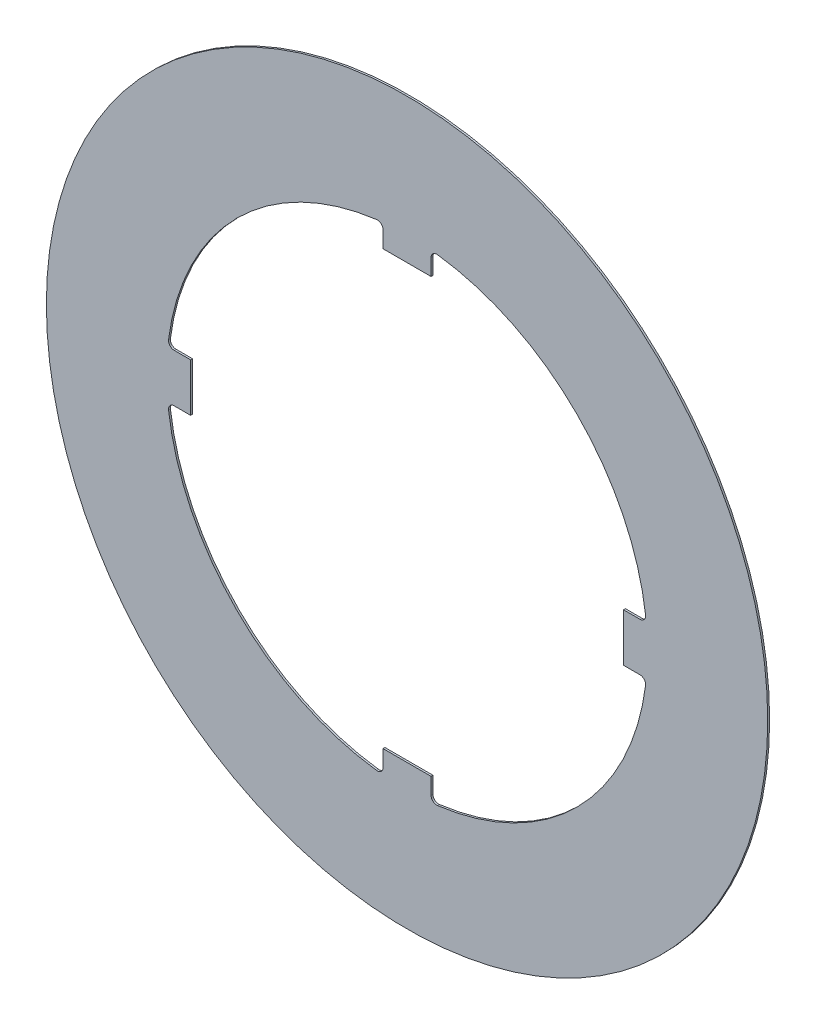
ISO-10303-21;
HEADER;
FILE_DESCRIPTION(('STEP AP214'),'2;1');
FILE_NAME('part.step','',(''),(''),'','','');
FILE_SCHEMA(('AUTOMOTIVE_DESIGN { 1 0 10303 214 1 1 1 1 }'));
ENDSEC;
DATA;
#1=APPLICATION_CONTEXT('core data for automotive mechanical design processes');
#2=APPLICATION_PROTOCOL_DEFINITION('international standard','automotive_design',2000,#1);
#3=PRODUCT_CONTEXT('',#1,'mechanical');
#4=PRODUCT('Part','Part','',(#3));
#5=PRODUCT_RELATED_PRODUCT_CATEGORY('part','',(#4));
#6=PRODUCT_DEFINITION_FORMATION('','',#4);
#7=PRODUCT_DEFINITION_CONTEXT('part definition',#1,'design');
#8=PRODUCT_DEFINITION('design','',#6,#7);
#9=PRODUCT_DEFINITION_SHAPE('','',#8);
#10=(LENGTH_UNIT() NAMED_UNIT(*) SI_UNIT(.MILLI.,.METRE.));
#11=(NAMED_UNIT(*) PLANE_ANGLE_UNIT() SI_UNIT($,.RADIAN.));
#12=(NAMED_UNIT(*) SI_UNIT($,.STERADIAN.) SOLID_ANGLE_UNIT());
#13=UNCERTAINTY_MEASURE_WITH_UNIT(LENGTH_MEASURE(1.E-05),#10,'distance_accuracy_value','');
#14=(GEOMETRIC_REPRESENTATION_CONTEXT(3) GLOBAL_UNCERTAINTY_ASSIGNED_CONTEXT((#13)) GLOBAL_UNIT_ASSIGNED_CONTEXT((#10,
#11,#12)) REPRESENTATION_CONTEXT('',''));
#15=CARTESIAN_POINT('',(0.,0.,0.));
#16=DIRECTION('',(0.,0.,1.));
#17=DIRECTION('',(1.,0.,0.));
#18=AXIS2_PLACEMENT_3D('',#15,#16,#17);
#19=CARTESIAN_POINT('',(0.,0.,5.));
#20=DIRECTION('',(0.,0.,-1.));
#21=DIRECTION('',(-1.,0.,0.));
#22=AXIS2_PLACEMENT_3D('',#19,#20,#21);
#23=CYLINDRICAL_SURFACE('',#22,1270.);
#24=CARTESIAN_POINT('',(0.,0.,-5.));
#25=DIRECTION('',(0.,0.,1.));
#26=DIRECTION('',(1.,0.,0.));
#27=AXIS2_PLACEMENT_3D('',#24,#25,#26);
#28=CIRCLE('',#27,1270.);
#29=CARTESIAN_POINT('',(160.79838709677,-1259.77929761807,-5.));
#30=VERTEX_POINT('',#29);
#31=CARTESIAN_POINT('',(1259.77929761807,-160.798387096774,-5.));
#32=VERTEX_POINT('',#31);
#33=EDGE_CURVE('E242',#30,#32,#28,.T.);
#34=ORIENTED_EDGE('',*,*,#33,.F.);
#35=DIRECTION('',(0.,0.,-1.));
#36=VECTOR('',#35,1.);
#37=CARTESIAN_POINT('',(160.79838709677,-1259.77929761807,5.));
#38=LINE('',#37,#36);
#39=CARTESIAN_POINT('',(160.79838709677,-1259.77929761807,5.));
#40=VERTEX_POINT('',#39);
#41=EDGE_CURVE('E11',#40,#30,#38,.T.);
#42=ORIENTED_EDGE('',*,*,#41,.F.);
#43=CARTESIAN_POINT('',(0.,0.,5.));
#44=DIRECTION('',(0.,0.,1.));
#45=DIRECTION('',(1.,0.,0.));
#46=AXIS2_PLACEMENT_3D('',#43,#44,#45);
#47=CIRCLE('',#46,1270.);
#48=CARTESIAN_POINT('',(1259.77929761807,-160.798387096774,5.));
#49=VERTEX_POINT('',#48);
#50=EDGE_CURVE('E335',#40,#49,#47,.T.);
#51=ORIENTED_EDGE('',*,*,#50,.T.);
#52=DIRECTION('',(0.,0.,-1.));
#53=VECTOR('',#52,1.);
#54=CARTESIAN_POINT('',(1259.77929761807,-160.798387096774,5.));
#55=LINE('',#54,#53);
#56=EDGE_CURVE('E60',#49,#32,#55,.T.);
#57=ORIENTED_EDGE('',*,*,#56,.T.);
#58=EDGE_LOOP('',(#34,#42,#51,#57));
#59=FACE_BOUND('',#58,.T.);
#60=ADVANCED_FACE('F43',(#59),#23,.F.);
#61=CARTESIAN_POINT('',(156.999999999996,-1230.0207315326,5.));
#62=DIRECTION('',(0.,0.,-1.));
#63=DIRECTION('',(-1.,0.,0.));
#64=AXIS2_PLACEMENT_3D('',#61,#62,#63);
#65=CYLINDRICAL_SURFACE('',#64,30.0000000000002);
#66=CARTESIAN_POINT('',(156.999999999996,-1230.0207315326,-5.));
#67=DIRECTION('',(0.,0.,1.));
#68=DIRECTION('',(1.,0.,0.));
#69=AXIS2_PLACEMENT_3D('',#66,#67,#68);
#70=CIRCLE('',#69,30.0000000000002);
#71=CARTESIAN_POINT('',(126.999999999996,-1230.0207315326,-5.));
#72=VERTEX_POINT('',#71);
#73=EDGE_CURVE('E245',#30,#72,#70,.F.);
#74=ORIENTED_EDGE('',*,*,#73,.T.);
#75=DIRECTION('',(0.,0.,-1.));
#76=VECTOR('',#75,1.);
#77=CARTESIAN_POINT('',(126.999999999996,-1230.0207315326,5.));
#78=LINE('',#77,#76);
#79=CARTESIAN_POINT('',(126.999999999996,-1230.0207315326,5.));
#80=VERTEX_POINT('',#79);
#81=EDGE_CURVE('E52',#80,#72,#78,.T.);
#82=ORIENTED_EDGE('',*,*,#81,.F.);
#83=CARTESIAN_POINT('',(156.999999999996,-1230.0207315326,5.));
#84=DIRECTION('',(0.,0.,1.));
#85=DIRECTION('',(1.,0.,0.));
#86=AXIS2_PLACEMENT_3D('',#83,#84,#85);
#87=CIRCLE('',#86,30.0000000000002);
#88=EDGE_CURVE('E865',#40,#80,#87,.F.);
#89=ORIENTED_EDGE('',*,*,#88,.F.);
#90=ORIENTED_EDGE('',*,*,#41,.T.);
#91=EDGE_LOOP('',(#74,#82,#89,#90));
#92=FACE_BOUND('',#91,.T.);
#93=ADVANCED_FACE('F408',(#92),#65,.F.);
#94=CARTESIAN_POINT('',(127.,-4.05071072272497E-13,5.));
#95=DIRECTION('',(1.,0.,0.));
#96=DIRECTION('',(0.,1.,0.));
#97=AXIS2_PLACEMENT_3D('',#94,#95,#96);
#98=PLANE('',#97);
#99=DIRECTION('',(0.,-1.,0.));
#100=VECTOR('',#99,1.);
#101=CARTESIAN_POINT('',(127.,-4.05071072272497E-13,-5.));
#102=LINE('',#101,#100);
#103=CARTESIAN_POINT('',(126.999999999996,-1143.,-5.));
#104=VERTEX_POINT('',#103);
#105=EDGE_CURVE('E249',#104,#72,#102,.T.);
#106=ORIENTED_EDGE('',*,*,#105,.F.);
#107=DIRECTION('',(0.,0.,-1.));
#108=VECTOR('',#107,1.);
#109=CARTESIAN_POINT('',(126.999999999996,-1143.,5.));
#110=LINE('',#109,#108);
#111=CARTESIAN_POINT('',(126.999999999996,-1143.,5.));
#112=VERTEX_POINT('',#111);
#113=EDGE_CURVE('E396',#112,#104,#110,.T.);
#114=ORIENTED_EDGE('',*,*,#113,.F.);
#115=DIRECTION('',(0.,-1.,0.));
#116=VECTOR('',#115,1.);
#117=CARTESIAN_POINT('',(127.,-4.05071072272497E-13,5.));
#118=LINE('',#117,#116);
#119=EDGE_CURVE('E405',#112,#80,#118,.T.);
#120=ORIENTED_EDGE('',*,*,#119,.T.);
#121=ORIENTED_EDGE('',*,*,#81,.T.);
#122=EDGE_LOOP('',(#106,#114,#120,#121));
#123=FACE_BOUND('',#122,.T.);
#124=ADVANCED_FACE('F403',(#123),#98,.T.);
#125=CARTESIAN_POINT('',(-3.99680288865056E-12,-1143.,5.));
#126=DIRECTION('',(0.,-1.,0.));
#127=DIRECTION('',(1.,0.,0.));
#128=AXIS2_PLACEMENT_3D('',#125,#126,#127);
#129=PLANE('',#128);
#130=DIRECTION('',(-1.,0.,0.));
#131=VECTOR('',#130,1.);
#132=CARTESIAN_POINT('',(-3.99680288865056E-12,-1143.,-5.));
#133=LINE('',#132,#131);
#134=CARTESIAN_POINT('',(-127.000000000004,-1143.,-5.));
#135=VERTEX_POINT('',#134);
#136=EDGE_CURVE('E253',#104,#135,#133,.T.);
#137=ORIENTED_EDGE('',*,*,#136,.T.);
#138=DIRECTION('',(0.,0.,-1.));
#139=VECTOR('',#138,1.);
#140=CARTESIAN_POINT('',(-127.000000000004,-1143.,5.));
#141=LINE('',#140,#139);
#142=CARTESIAN_POINT('',(-127.000000000004,-1143.,5.));
#143=VERTEX_POINT('',#142);
#144=EDGE_CURVE('E392',#143,#135,#141,.T.);
#145=ORIENTED_EDGE('',*,*,#144,.F.);
#146=DIRECTION('',(-1.,0.,0.));
#147=VECTOR('',#146,1.);
#148=CARTESIAN_POINT('',(-3.99680288865056E-12,-1143.,5.));
#149=LINE('',#148,#147);
#150=EDGE_CURVE('E427',#112,#143,#149,.T.);
#151=ORIENTED_EDGE('',*,*,#150,.F.);
#152=ORIENTED_EDGE('',*,*,#113,.T.);
#153=EDGE_LOOP('',(#137,#145,#151,#152));
#154=FACE_BOUND('',#153,.T.);
#155=ADVANCED_FACE('F416',(#154),#129,.F.);
#156=CARTESIAN_POINT('',(-126.999999999999,5.26592393954245E-13,5.));
#157=DIRECTION('',(1.,0.,0.));
#158=DIRECTION('',(0.,1.,0.));
#159=AXIS2_PLACEMENT_3D('',#156,#157,#158);
#160=PLANE('',#159);
#161=DIRECTION('',(0.,-1.,0.));
#162=VECTOR('',#161,1.);
#163=CARTESIAN_POINT('',(-126.999999999999,5.26592393954245E-13,-5.));
#164=LINE('',#163,#162);
#165=CARTESIAN_POINT('',(-127.000000000004,-1230.0207315326,-5.));
#166=VERTEX_POINT('',#165);
#167=EDGE_CURVE('E256',#135,#166,#164,.T.);
#168=ORIENTED_EDGE('',*,*,#167,.T.);
#169=DIRECTION('',(0.,0.,-1.));
#170=VECTOR('',#169,1.);
#171=CARTESIAN_POINT('',(-127.000000000004,-1230.0207315326,5.));
#172=LINE('',#171,#170);
#173=CARTESIAN_POINT('',(-127.000000000004,-1230.0207315326,5.));
#174=VERTEX_POINT('',#173);
#175=EDGE_CURVE('E389',#174,#166,#172,.T.);
#176=ORIENTED_EDGE('',*,*,#175,.F.);
#177=DIRECTION('',(0.,-1.,0.));
#178=VECTOR('',#177,1.);
#179=CARTESIAN_POINT('',(-126.999999999999,5.26592393954245E-13,5.));
#180=LINE('',#179,#178);
#181=EDGE_CURVE('E422',#143,#174,#180,.T.);
#182=ORIENTED_EDGE('',*,*,#181,.F.);
#183=ORIENTED_EDGE('',*,*,#144,.T.);
#184=EDGE_LOOP('',(#168,#176,#182,#183));
#185=FACE_BOUND('',#184,.T.);
#186=ADVANCED_FACE('F420',(#185),#160,.F.);
#187=CARTESIAN_POINT('',(-157.000000000004,-1230.0207315326,5.));
#188=DIRECTION('',(0.,0.,-1.));
#189=DIRECTION('',(-1.,0.,0.));
#190=AXIS2_PLACEMENT_3D('',#187,#188,#189);
#191=CYLINDRICAL_SURFACE('',#190,30.);
#192=CARTESIAN_POINT('',(-157.000000000004,-1230.0207315326,-5.));
#193=DIRECTION('',(0.,0.,1.));
#194=DIRECTION('',(1.,0.,0.));
#195=AXIS2_PLACEMENT_3D('',#192,#193,#194);
#196=CIRCLE('',#195,30.);
#197=CARTESIAN_POINT('',(-160.798387096779,-1259.77929761807,-5.));
#198=VERTEX_POINT('',#197);
#199=EDGE_CURVE('E260',#198,#166,#196,.T.);
#200=ORIENTED_EDGE('',*,*,#199,.F.);
#201=DIRECTION('',(0.,0.,-1.));
#202=VECTOR('',#201,1.);
#203=CARTESIAN_POINT('',(-160.798387096779,-1259.77929761807,5.));
#204=LINE('',#203,#202);
#205=CARTESIAN_POINT('',(-160.798387096779,-1259.77929761807,5.));
#206=VERTEX_POINT('',#205);
#207=EDGE_CURVE('E386',#206,#198,#204,.T.);
#208=ORIENTED_EDGE('',*,*,#207,.F.);
#209=CARTESIAN_POINT('',(-157.000000000004,-1230.0207315326,5.));
#210=DIRECTION('',(0.,0.,1.));
#211=DIRECTION('',(1.,0.,0.));
#212=AXIS2_PLACEMENT_3D('',#209,#210,#211);
#213=CIRCLE('',#212,30.);
#214=EDGE_CURVE('E426',#206,#174,#213,.T.);
#215=ORIENTED_EDGE('',*,*,#214,.T.);
#216=ORIENTED_EDGE('',*,*,#175,.T.);
#217=EDGE_LOOP('',(#200,#208,#215,#216));
#218=FACE_BOUND('',#217,.T.);
#219=ADVANCED_FACE('F513',(#218),#191,.F.);
#220=CARTESIAN_POINT('',(0.,0.,5.));
#221=DIRECTION('',(0.,0.,-1.));
#222=DIRECTION('',(-1.,0.,0.));
#223=AXIS2_PLACEMENT_3D('',#220,#221,#222);
#224=CYLINDRICAL_SURFACE('',#223,1270.);
#225=CARTESIAN_POINT('',(0.,0.,-5.));
#226=DIRECTION('',(0.,0.,1.));
#227=DIRECTION('',(1.,0.,0.));
#228=AXIS2_PLACEMENT_3D('',#225,#226,#227);
#229=CIRCLE('',#228,1270.);
#230=CARTESIAN_POINT('',(-1259.77929761807,-160.798387096765,-5.));
#231=VERTEX_POINT('',#230);
#232=EDGE_CURVE('E264',#231,#198,#229,.T.);
#233=ORIENTED_EDGE('',*,*,#232,.F.);
#234=DIRECTION('',(0.,0.,-1.));
#235=VECTOR('',#234,1.);
#236=CARTESIAN_POINT('',(-1259.77929761807,-160.798387096765,5.));
#237=LINE('',#236,#235);
#238=CARTESIAN_POINT('',(-1259.77929761807,-160.798387096765,5.));
#239=VERTEX_POINT('',#238);
#240=EDGE_CURVE('E383',#239,#231,#237,.T.);
#241=ORIENTED_EDGE('',*,*,#240,.F.);
#242=CARTESIAN_POINT('',(0.,0.,5.));
#243=DIRECTION('',(0.,0.,1.));
#244=DIRECTION('',(1.,0.,0.));
#245=AXIS2_PLACEMENT_3D('',#242,#243,#244);
#246=CIRCLE('',#245,1270.);
#247=EDGE_CURVE('E431',#239,#206,#246,.T.);
#248=ORIENTED_EDGE('',*,*,#247,.T.);
#249=ORIENTED_EDGE('',*,*,#207,.T.);
#250=EDGE_LOOP('',(#233,#241,#248,#249));
#251=FACE_BOUND('',#250,.T.);
#252=ADVANCED_FACE('F516',(#251),#224,.F.);
#253=CARTESIAN_POINT('',(-1230.0207315326,-156.999999999991,5.));
#254=DIRECTION('',(0.,0.,-1.));
#255=DIRECTION('',(-1.,0.,0.));
#256=AXIS2_PLACEMENT_3D('',#253,#254,#255);
#257=CYLINDRICAL_SURFACE('',#256,30.0000000000001);
#258=CARTESIAN_POINT('',(-1230.0207315326,-156.999999999991,-5.));
#259=DIRECTION('',(0.,0.,1.));
#260=DIRECTION('',(1.,0.,0.));
#261=AXIS2_PLACEMENT_3D('',#258,#259,#260);
#262=CIRCLE('',#261,30.0000000000001);
#263=CARTESIAN_POINT('',(-1230.0207315326,-126.999999999991,-5.));
#264=VERTEX_POINT('',#263);
#265=EDGE_CURVE('E268',#231,#264,#262,.F.);
#266=ORIENTED_EDGE('',*,*,#265,.T.);
#267=DIRECTION('',(0.,0.,-1.));
#268=VECTOR('',#267,1.);
#269=CARTESIAN_POINT('',(-1230.0207315326,-126.999999999991,5.));
#270=LINE('',#269,#268);
#271=CARTESIAN_POINT('',(-1230.0207315326,-126.999999999991,5.));
#272=VERTEX_POINT('',#271);
#273=EDGE_CURVE('E380',#272,#264,#270,.T.);
#274=ORIENTED_EDGE('',*,*,#273,.F.);
#275=CARTESIAN_POINT('',(-1230.0207315326,-156.999999999991,5.));
#276=DIRECTION('',(0.,0.,1.));
#277=DIRECTION('',(1.,0.,0.));
#278=AXIS2_PLACEMENT_3D('',#275,#276,#277);
#279=CIRCLE('',#278,30.0000000000001);
#280=EDGE_CURVE('E439',#239,#272,#279,.F.);
#281=ORIENTED_EDGE('',*,*,#280,.F.);
#282=ORIENTED_EDGE('',*,*,#240,.T.);
#283=EDGE_LOOP('',(#266,#274,#281,#282));
#284=FACE_BOUND('',#283,.T.);
#285=ADVANCED_FACE('F520',(#284),#257,.F.);
#286=CARTESIAN_POINT('',(-8.10142144544992E-13,-126.999999999999,5.));
#287=DIRECTION('',(0.,-1.,0.));
#288=DIRECTION('',(1.,0.,0.));
#289=AXIS2_PLACEMENT_3D('',#286,#287,#288);
#290=PLANE('',#289);
#291=DIRECTION('',(-1.,0.,0.));
#292=VECTOR('',#291,1.);
#293=CARTESIAN_POINT('',(-8.10142144544992E-13,-126.999999999999,-5.));
#294=LINE('',#293,#292);
#295=CARTESIAN_POINT('',(-1143.,-126.999999999992,-5.));
#296=VERTEX_POINT('',#295);
#297=EDGE_CURVE('E272',#296,#264,#294,.T.);
#298=ORIENTED_EDGE('',*,*,#297,.F.);
#299=DIRECTION('',(0.,0.,-1.));
#300=VECTOR('',#299,1.);
#301=CARTESIAN_POINT('',(-1143.,-126.999999999992,5.));
#302=LINE('',#301,#300);
#303=CARTESIAN_POINT('',(-1143.,-126.999999999992,5.));
#304=VERTEX_POINT('',#303);
#305=EDGE_CURVE('E377',#304,#296,#302,.T.);
#306=ORIENTED_EDGE('',*,*,#305,.F.);
#307=DIRECTION('',(-1.,0.,0.));
#308=VECTOR('',#307,1.);
#309=CARTESIAN_POINT('',(-8.10142144544992E-13,-126.999999999999,5.));
#310=LINE('',#309,#308);
#311=EDGE_CURVE('E442',#304,#272,#310,.T.);
#312=ORIENTED_EDGE('',*,*,#311,.T.);
#313=ORIENTED_EDGE('',*,*,#273,.T.);
#314=EDGE_LOOP('',(#298,#306,#312,#313));
#315=FACE_BOUND('',#314,.T.);
#316=ADVANCED_FACE('F524',(#315),#290,.T.);
#317=CARTESIAN_POINT('',(-1143.,7.99360577730113E-12,5.));
#318=DIRECTION('',(-1.,0.,0.));
#319=DIRECTION('',(0.,-1.,0.));
#320=AXIS2_PLACEMENT_3D('',#317,#318,#319);
#321=PLANE('',#320);
#322=DIRECTION('',(0.,1.,0.));
#323=VECTOR('',#322,1.);
#324=CARTESIAN_POINT('',(-1143.,7.99360577730113E-12,-5.));
#325=LINE('',#324,#323);
#326=CARTESIAN_POINT('',(-1143.,127.000000000008,-5.));
#327=VERTEX_POINT('',#326);
#328=EDGE_CURVE('E276',#296,#327,#325,.T.);
#329=ORIENTED_EDGE('',*,*,#328,.T.);
#330=DIRECTION('',(0.,0.,-1.));
#331=VECTOR('',#330,1.);
#332=CARTESIAN_POINT('',(-1143.,127.000000000008,5.));
#333=LINE('',#332,#331);
#334=CARTESIAN_POINT('',(-1143.,127.000000000008,5.));
#335=VERTEX_POINT('',#334);
#336=EDGE_CURVE('E373',#335,#327,#333,.T.);
#337=ORIENTED_EDGE('',*,*,#336,.F.);
#338=DIRECTION('',(0.,1.,0.));
#339=VECTOR('',#338,1.);
#340=CARTESIAN_POINT('',(-1143.,7.99360577730113E-12,5.));
#341=LINE('',#340,#339);
#342=EDGE_CURVE('E446',#304,#335,#341,.T.);
#343=ORIENTED_EDGE('',*,*,#342,.F.);
#344=ORIENTED_EDGE('',*,*,#305,.T.);
#345=EDGE_LOOP('',(#329,#337,#343,#344));
#346=FACE_BOUND('',#345,.T.);
#347=ADVANCED_FACE('F528',(#346),#321,.F.);
#348=CARTESIAN_POINT('',(9.31663466226743E-13,127.,5.));
#349=DIRECTION('',(0.,-1.,0.));
#350=DIRECTION('',(1.,0.,0.));
#351=AXIS2_PLACEMENT_3D('',#348,#349,#350);
#352=PLANE('',#351);
#353=DIRECTION('',(-1.,0.,0.));
#354=VECTOR('',#353,1.);
#355=CARTESIAN_POINT('',(9.31663466226743E-13,127.,-5.));
#356=LINE('',#355,#354);
#357=CARTESIAN_POINT('',(-1230.0207315326,127.000000000009,-5.));
#358=VERTEX_POINT('',#357);
#359=EDGE_CURVE('E279',#327,#358,#356,.T.);
#360=ORIENTED_EDGE('',*,*,#359,.T.);
#361=DIRECTION('',(0.,0.,-1.));
#362=VECTOR('',#361,1.);
#363=CARTESIAN_POINT('',(-1230.0207315326,127.000000000009,5.));
#364=LINE('',#363,#362);
#365=CARTESIAN_POINT('',(-1230.0207315326,127.000000000009,5.));
#366=VERTEX_POINT('',#365);
#367=EDGE_CURVE('E370',#366,#358,#364,.T.);
#368=ORIENTED_EDGE('',*,*,#367,.F.);
#369=DIRECTION('',(-1.,0.,0.));
#370=VECTOR('',#369,1.);
#371=CARTESIAN_POINT('',(9.31663466226743E-13,127.,5.));
#372=LINE('',#371,#370);
#373=EDGE_CURVE('E449',#335,#366,#372,.T.);
#374=ORIENTED_EDGE('',*,*,#373,.F.);
#375=ORIENTED_EDGE('',*,*,#336,.T.);
#376=EDGE_LOOP('',(#360,#368,#374,#375));
#377=FACE_BOUND('',#376,.T.);
#378=ADVANCED_FACE('F532',(#377),#352,.F.);
#379=CARTESIAN_POINT('',(-1230.0207315326,157.000000000009,5.));
#380=DIRECTION('',(0.,0.,-1.));
#381=DIRECTION('',(-1.,0.,0.));
#382=AXIS2_PLACEMENT_3D('',#379,#380,#381);
#383=CYLINDRICAL_SURFACE('',#382,30.0000000000001);
#384=CARTESIAN_POINT('',(-1230.0207315326,157.000000000009,-5.));
#385=DIRECTION('',(0.,0.,1.));
#386=DIRECTION('',(1.,0.,0.));
#387=AXIS2_PLACEMENT_3D('',#384,#385,#386);
#388=CIRCLE('',#387,30.0000000000001);
#389=CARTESIAN_POINT('',(-1259.77929761807,160.798387096783,-5.));
#390=VERTEX_POINT('',#389);
#391=EDGE_CURVE('E283',#390,#358,#388,.T.);
#392=ORIENTED_EDGE('',*,*,#391,.F.);
#393=DIRECTION('',(0.,0.,-1.));
#394=VECTOR('',#393,1.);
#395=CARTESIAN_POINT('',(-1259.77929761807,160.798387096783,5.));
#396=LINE('',#395,#394);
#397=CARTESIAN_POINT('',(-1259.77929761807,160.798387096783,5.));
#398=VERTEX_POINT('',#397);
#399=EDGE_CURVE('E367',#398,#390,#396,.T.);
#400=ORIENTED_EDGE('',*,*,#399,.F.);
#401=CARTESIAN_POINT('',(-1230.0207315326,157.000000000009,5.));
#402=DIRECTION('',(0.,0.,1.));
#403=DIRECTION('',(1.,0.,0.));
#404=AXIS2_PLACEMENT_3D('',#401,#402,#403);
#405=CIRCLE('',#404,30.0000000000001);
#406=EDGE_CURVE('E452',#398,#366,#405,.T.);
#407=ORIENTED_EDGE('',*,*,#406,.T.);
#408=ORIENTED_EDGE('',*,*,#367,.T.);
#409=EDGE_LOOP('',(#392,#400,#407,#408));
#410=FACE_BOUND('',#409,.T.);
#411=ADVANCED_FACE('F536',(#410),#383,.F.);
#412=CARTESIAN_POINT('',(0.,0.,5.));
#413=DIRECTION('',(0.,0.,-1.));
#414=DIRECTION('',(-1.,0.,0.));
#415=AXIS2_PLACEMENT_3D('',#412,#413,#414);
#416=CYLINDRICAL_SURFACE('',#415,1270.);
#417=CARTESIAN_POINT('',(0.,0.,-5.));
#418=DIRECTION('',(0.,0.,1.));
#419=DIRECTION('',(1.,0.,0.));
#420=AXIS2_PLACEMENT_3D('',#417,#418,#419);
#421=CIRCLE('',#420,1270.);
#422=CARTESIAN_POINT('',(-160.798387096761,1259.77929761807,-5.));
#423=VERTEX_POINT('',#422);
#424=EDGE_CURVE('E287',#423,#390,#421,.T.);
#425=ORIENTED_EDGE('',*,*,#424,.F.);
#426=DIRECTION('',(0.,0.,-1.));
#427=VECTOR('',#426,1.);
#428=CARTESIAN_POINT('',(-160.798387096761,1259.77929761807,5.));
#429=LINE('',#428,#427);
#430=CARTESIAN_POINT('',(-160.798387096761,1259.77929761807,5.));
#431=VERTEX_POINT('',#430);
#432=EDGE_CURVE('E364',#431,#423,#429,.T.);
#433=ORIENTED_EDGE('',*,*,#432,.F.);
#434=CARTESIAN_POINT('',(0.,0.,5.));
#435=DIRECTION('',(0.,0.,1.));
#436=DIRECTION('',(1.,0.,0.));
#437=AXIS2_PLACEMENT_3D('',#434,#435,#436);
#438=CIRCLE('',#437,1270.);
#439=EDGE_CURVE('E456',#431,#398,#438,.T.);
#440=ORIENTED_EDGE('',*,*,#439,.T.);
#441=ORIENTED_EDGE('',*,*,#399,.T.);
#442=EDGE_LOOP('',(#425,#433,#440,#441));
#443=FACE_BOUND('',#442,.T.);
#444=ADVANCED_FACE('F540',(#443),#416,.F.);
#445=CARTESIAN_POINT('',(-156.999999999987,1230.0207315326,5.));
#446=DIRECTION('',(0.,0.,-1.));
#447=DIRECTION('',(-1.,0.,0.));
#448=AXIS2_PLACEMENT_3D('',#445,#446,#447);
#449=CYLINDRICAL_SURFACE('',#448,30.0000000000002);
#450=CARTESIAN_POINT('',(-156.999999999987,1230.0207315326,-5.));
#451=DIRECTION('',(0.,0.,1.));
#452=DIRECTION('',(1.,0.,0.));
#453=AXIS2_PLACEMENT_3D('',#450,#451,#452);
#454=CIRCLE('',#453,30.0000000000002);
#455=CARTESIAN_POINT('',(-126.999999999987,1230.0207315326,-5.));
#456=VERTEX_POINT('',#455);
#457=EDGE_CURVE('E291',#423,#456,#454,.F.);
#458=ORIENTED_EDGE('',*,*,#457,.T.);
#459=DIRECTION('',(0.,0.,-1.));
#460=VECTOR('',#459,1.);
#461=CARTESIAN_POINT('',(-126.999999999987,1230.0207315326,5.));
#462=LINE('',#461,#460);
#463=CARTESIAN_POINT('',(-126.999999999987,1230.0207315326,5.));
#464=VERTEX_POINT('',#463);
#465=EDGE_CURVE('E361',#464,#456,#462,.T.);
#466=ORIENTED_EDGE('',*,*,#465,.F.);
#467=CARTESIAN_POINT('',(-156.999999999987,1230.0207315326,5.));
#468=DIRECTION('',(0.,0.,1.));
#469=DIRECTION('',(1.,0.,0.));
#470=AXIS2_PLACEMENT_3D('',#467,#468,#469);
#471=CIRCLE('',#470,30.0000000000002);
#472=EDGE_CURVE('E460',#431,#464,#471,.F.);
#473=ORIENTED_EDGE('',*,*,#472,.F.);
#474=ORIENTED_EDGE('',*,*,#432,.T.);
#475=EDGE_LOOP('',(#458,#466,#473,#474));
#476=FACE_BOUND('',#475,.T.);
#477=ADVANCED_FACE('F544',(#476),#449,.F.);
#478=CARTESIAN_POINT('',(-127.,1.29622743127199E-12,5.));
#479=DIRECTION('',(-1.,0.,0.));
#480=DIRECTION('',(0.,-1.,0.));
#481=AXIS2_PLACEMENT_3D('',#478,#479,#480);
#482=PLANE('',#481);
#483=DIRECTION('',(0.,1.,0.));
#484=VECTOR('',#483,1.);
#485=CARTESIAN_POINT('',(-127.,1.29622743127199E-12,-5.));
#486=LINE('',#485,#484);
#487=CARTESIAN_POINT('',(-126.999999999988,1143.,-5.));
#488=VERTEX_POINT('',#487);
#489=EDGE_CURVE('E295',#488,#456,#486,.T.);
#490=ORIENTED_EDGE('',*,*,#489,.F.);
#491=DIRECTION('',(0.,0.,-1.));
#492=VECTOR('',#491,1.);
#493=CARTESIAN_POINT('',(-126.999999999988,1143.,5.));
#494=LINE('',#493,#492);
#495=CARTESIAN_POINT('',(-126.999999999988,1143.,5.));
#496=VERTEX_POINT('',#495);
#497=EDGE_CURVE('E358',#496,#488,#494,.T.);
#498=ORIENTED_EDGE('',*,*,#497,.F.);
#499=DIRECTION('',(0.,1.,0.));
#500=VECTOR('',#499,1.);
#501=CARTESIAN_POINT('',(-127.,1.29622743127199E-12,5.));
#502=LINE('',#501,#500);
#503=EDGE_CURVE('E463',#496,#464,#502,.T.);
#504=ORIENTED_EDGE('',*,*,#503,.T.);
#505=ORIENTED_EDGE('',*,*,#465,.T.);
#506=EDGE_LOOP('',(#490,#498,#504,#505));
#507=FACE_BOUND('',#506,.T.);
#508=ADVANCED_FACE('F548',(#507),#482,.T.);
#509=CARTESIAN_POINT('',(1.19904086659517E-11,1143.,5.));
#510=DIRECTION('',(0.,1.,0.));
#511=DIRECTION('',(-1.,0.,0.));
#512=AXIS2_PLACEMENT_3D('',#509,#510,#511);
#513=PLANE('',#512);
#514=DIRECTION('',(1.,0.,0.));
#515=VECTOR('',#514,1.);
#516=CARTESIAN_POINT('',(1.19904086659517E-11,1143.,-5.));
#517=LINE('',#516,#515);
#518=CARTESIAN_POINT('',(127.000000000012,1143.,-5.));
#519=VERTEX_POINT('',#518);
#520=EDGE_CURVE('E299',#488,#519,#517,.T.);
#521=ORIENTED_EDGE('',*,*,#520,.T.);
#522=DIRECTION('',(0.,0.,-1.));
#523=VECTOR('',#522,1.);
#524=CARTESIAN_POINT('',(127.000000000012,1143.,5.));
#525=LINE('',#524,#523);
#526=CARTESIAN_POINT('',(127.000000000012,1143.,5.));
#527=VERTEX_POINT('',#526);
#528=EDGE_CURVE('E354',#527,#519,#525,.T.);
#529=ORIENTED_EDGE('',*,*,#528,.F.);
#530=DIRECTION('',(1.,0.,0.));
#531=VECTOR('',#530,1.);
#532=CARTESIAN_POINT('',(1.19904086659517E-11,1143.,5.));
#533=LINE('',#532,#531);
#534=EDGE_CURVE('E467',#496,#527,#533,.T.);
#535=ORIENTED_EDGE('',*,*,#534,.F.);
#536=ORIENTED_EDGE('',*,*,#497,.T.);
#537=EDGE_LOOP('',(#521,#529,#535,#536));
#538=FACE_BOUND('',#537,.T.);
#539=ADVANCED_FACE('F552',(#538),#513,.F.);
#540=CARTESIAN_POINT('',(126.999999999999,-1.41774875295373E-12,5.));
#541=DIRECTION('',(-1.,0.,0.));
#542=DIRECTION('',(0.,-1.,0.));
#543=AXIS2_PLACEMENT_3D('',#540,#541,#542);
#544=PLANE('',#543);
#545=DIRECTION('',(0.,1.,0.));
#546=VECTOR('',#545,1.);
#547=CARTESIAN_POINT('',(126.999999999999,-1.41774875295373E-12,-5.));
#548=LINE('',#547,#546);
#549=CARTESIAN_POINT('',(127.000000000013,1230.0207315326,-5.));
#550=VERTEX_POINT('',#549);
#551=EDGE_CURVE('E302',#519,#550,#548,.T.);
#552=ORIENTED_EDGE('',*,*,#551,.T.);
#553=DIRECTION('',(0.,0.,-1.));
#554=VECTOR('',#553,1.);
#555=CARTESIAN_POINT('',(127.000000000013,1230.0207315326,5.));
#556=LINE('',#555,#554);
#557=CARTESIAN_POINT('',(127.000000000013,1230.0207315326,5.));
#558=VERTEX_POINT('',#557);
#559=EDGE_CURVE('E351',#558,#550,#556,.T.);
#560=ORIENTED_EDGE('',*,*,#559,.F.);
#561=DIRECTION('',(0.,1.,0.));
#562=VECTOR('',#561,1.);
#563=CARTESIAN_POINT('',(126.999999999999,-1.41774875295373E-12,5.));
#564=LINE('',#563,#562);
#565=EDGE_CURVE('E470',#527,#558,#564,.T.);
#566=ORIENTED_EDGE('',*,*,#565,.F.);
#567=ORIENTED_EDGE('',*,*,#528,.T.);
#568=EDGE_LOOP('',(#552,#560,#566,#567));
#569=FACE_BOUND('',#568,.T.);
#570=ADVANCED_FACE('F556',(#569),#544,.F.);
#571=CARTESIAN_POINT('',(157.000000000013,1230.0207315326,5.));
#572=DIRECTION('',(0.,0.,-1.));
#573=DIRECTION('',(-1.,0.,0.));
#574=AXIS2_PLACEMENT_3D('',#571,#572,#573);
#575=CYLINDRICAL_SURFACE('',#574,30.);
#576=CARTESIAN_POINT('',(157.000000000013,1230.0207315326,-5.));
#577=DIRECTION('',(0.,0.,1.));
#578=DIRECTION('',(1.,0.,0.));
#579=AXIS2_PLACEMENT_3D('',#576,#577,#578);
#580=CIRCLE('',#579,30.);
#581=CARTESIAN_POINT('',(160.798387096787,1259.77929761807,-5.));
#582=VERTEX_POINT('',#581);
#583=EDGE_CURVE('E306',#582,#550,#580,.T.);
#584=ORIENTED_EDGE('',*,*,#583,.F.);
#585=DIRECTION('',(0.,0.,-1.));
#586=VECTOR('',#585,1.);
#587=CARTESIAN_POINT('',(160.798387096787,1259.77929761807,5.));
#588=LINE('',#587,#586);
#589=CARTESIAN_POINT('',(160.798387096787,1259.77929761807,5.));
#590=VERTEX_POINT('',#589);
#591=EDGE_CURVE('E348',#590,#582,#588,.T.);
#592=ORIENTED_EDGE('',*,*,#591,.F.);
#593=CARTESIAN_POINT('',(157.000000000013,1230.0207315326,5.));
#594=DIRECTION('',(0.,0.,1.));
#595=DIRECTION('',(1.,0.,0.));
#596=AXIS2_PLACEMENT_3D('',#593,#594,#595);
#597=CIRCLE('',#596,30.);
#598=EDGE_CURVE('E473',#590,#558,#597,.T.);
#599=ORIENTED_EDGE('',*,*,#598,.T.);
#600=ORIENTED_EDGE('',*,*,#559,.T.);
#601=EDGE_LOOP('',(#584,#592,#599,#600));
#602=FACE_BOUND('',#601,.T.);
#603=ADVANCED_FACE('F560',(#602),#575,.F.);
#604=CARTESIAN_POINT('',(0.,0.,5.));
#605=DIRECTION('',(0.,0.,-1.));
#606=DIRECTION('',(-1.,0.,0.));
#607=AXIS2_PLACEMENT_3D('',#604,#605,#606);
#608=CYLINDRICAL_SURFACE('',#607,1270.);
#609=CARTESIAN_POINT('',(0.,0.,-5.));
#610=DIRECTION('',(0.,0.,1.));
#611=DIRECTION('',(1.,0.,0.));
#612=AXIS2_PLACEMENT_3D('',#609,#610,#611);
#613=CIRCLE('',#612,1270.);
#614=CARTESIAN_POINT('',(1259.77929761807,160.798387096774,-5.));
#615=VERTEX_POINT('',#614);
#616=EDGE_CURVE('E310',#615,#582,#613,.T.);
#617=ORIENTED_EDGE('',*,*,#616,.F.);
#618=DIRECTION('',(0.,0.,-1.));
#619=VECTOR('',#618,1.);
#620=CARTESIAN_POINT('',(1259.77929761807,160.798387096774,5.));
#621=LINE('',#620,#619);
#622=CARTESIAN_POINT('',(1259.77929761807,160.798387096774,5.));
#623=VERTEX_POINT('',#622);
#624=EDGE_CURVE('E345',#623,#615,#621,.T.);
#625=ORIENTED_EDGE('',*,*,#624,.F.);
#626=CARTESIAN_POINT('',(0.,0.,5.));
#627=DIRECTION('',(0.,0.,1.));
#628=DIRECTION('',(1.,0.,0.));
#629=AXIS2_PLACEMENT_3D('',#626,#627,#628);
#630=CIRCLE('',#629,1270.);
#631=EDGE_CURVE('E477',#623,#590,#630,.T.);
#632=ORIENTED_EDGE('',*,*,#631,.T.);
#633=ORIENTED_EDGE('',*,*,#591,.T.);
#634=EDGE_LOOP('',(#617,#625,#632,#633));
#635=FACE_BOUND('',#634,.T.);
#636=ADVANCED_FACE('F564',(#635),#608,.F.);
#637=CARTESIAN_POINT('',(1230.0207315326,157.,5.));
#638=DIRECTION('',(0.,0.,-1.));
#639=DIRECTION('',(-1.,0.,0.));
#640=AXIS2_PLACEMENT_3D('',#637,#638,#639);
#641=CYLINDRICAL_SURFACE('',#640,30.0000000000001);
#642=CARTESIAN_POINT('',(1230.0207315326,157.,-5.));
#643=DIRECTION('',(0.,0.,1.));
#644=DIRECTION('',(1.,0.,0.));
#645=AXIS2_PLACEMENT_3D('',#642,#643,#644);
#646=CIRCLE('',#645,30.0000000000001);
#647=CARTESIAN_POINT('',(1230.0207315326,127.,-5.));
#648=VERTEX_POINT('',#647);
#649=EDGE_CURVE('E314',#615,#648,#646,.F.);
#650=ORIENTED_EDGE('',*,*,#649,.T.);
#651=DIRECTION('',(0.,0.,-1.));
#652=VECTOR('',#651,1.);
#653=CARTESIAN_POINT('',(1230.0207315326,127.,5.));
#654=LINE('',#653,#652);
#655=CARTESIAN_POINT('',(1230.0207315326,127.,5.));
#656=VERTEX_POINT('',#655);
#657=EDGE_CURVE('E342',#656,#648,#654,.T.);
#658=ORIENTED_EDGE('',*,*,#657,.F.);
#659=CARTESIAN_POINT('',(1230.0207315326,157.,5.));
#660=DIRECTION('',(0.,0.,1.));
#661=DIRECTION('',(1.,0.,0.));
#662=AXIS2_PLACEMENT_3D('',#659,#660,#661);
#663=CIRCLE('',#662,30.0000000000001);
#664=EDGE_CURVE('E481',#623,#656,#663,.F.);
#665=ORIENTED_EDGE('',*,*,#664,.F.);
#666=ORIENTED_EDGE('',*,*,#624,.T.);
#667=EDGE_LOOP('',(#650,#658,#665,#666));
#668=FACE_BOUND('',#667,.T.);
#669=ADVANCED_FACE('F568',(#668),#641,.F.);
#670=CARTESIAN_POINT('',(0.,127.,5.));
#671=DIRECTION('',(0.,1.,0.));
#672=DIRECTION('',(-1.,0.,0.));
#673=AXIS2_PLACEMENT_3D('',#670,#671,#672);
#674=PLANE('',#673);
#675=DIRECTION('',(1.,0.,0.));
#676=VECTOR('',#675,1.);
#677=CARTESIAN_POINT('',(0.,127.,-5.));
#678=LINE('',#677,#676);
#679=CARTESIAN_POINT('',(1143.,127.,-5.));
#680=VERTEX_POINT('',#679);
#681=EDGE_CURVE('E318',#680,#648,#678,.T.);
#682=ORIENTED_EDGE('',*,*,#681,.F.);
#683=DIRECTION('',(0.,0.,-1.));
#684=VECTOR('',#683,1.);
#685=CARTESIAN_POINT('',(1143.,127.,5.));
#686=LINE('',#685,#684);
#687=CARTESIAN_POINT('',(1143.,127.,5.));
#688=VERTEX_POINT('',#687);
#689=EDGE_CURVE('E228',#688,#680,#686,.T.);
#690=ORIENTED_EDGE('',*,*,#689,.F.);
#691=DIRECTION('',(1.,0.,0.));
#692=VECTOR('',#691,1.);
#693=CARTESIAN_POINT('',(0.,127.,5.));
#694=LINE('',#693,#692);
#695=EDGE_CURVE('E216',#688,#656,#694,.T.);
#696=ORIENTED_EDGE('',*,*,#695,.T.);
#697=ORIENTED_EDGE('',*,*,#657,.T.);
#698=EDGE_LOOP('',(#682,#690,#696,#697));
#699=FACE_BOUND('',#698,.T.);
#700=ADVANCED_FACE('F486',(#699),#674,.T.);
#701=CARTESIAN_POINT('',(1143.,0.,5.));
#702=DIRECTION('',(1.,0.,0.));
#703=DIRECTION('',(0.,0.,-1.));
#704=AXIS2_PLACEMENT_3D('',#701,#702,#703);
#705=PLANE('',#704);
#706=DIRECTION('',(0.,-1.,0.));
#707=VECTOR('',#706,1.);
#708=CARTESIAN_POINT('',(1143.,0.,-5.));
#709=LINE('',#708,#707);
#710=CARTESIAN_POINT('',(1143.,-127.,-5.));
#711=VERTEX_POINT('',#710);
#712=EDGE_CURVE('E224',#680,#711,#709,.T.);
#713=ORIENTED_EDGE('',*,*,#712,.T.);
#714=DIRECTION('',(0.,0.,-1.));
#715=VECTOR('',#714,1.);
#716=CARTESIAN_POINT('',(1143.,-127.,5.));
#717=LINE('',#716,#715);
#718=CARTESIAN_POINT('',(1143.,-127.,5.));
#719=VERTEX_POINT('',#718);
#720=EDGE_CURVE('E221',#719,#711,#717,.T.);
#721=ORIENTED_EDGE('',*,*,#720,.F.);
#722=DIRECTION('',(0.,-1.,0.));
#723=VECTOR('',#722,1.);
#724=CARTESIAN_POINT('',(1143.,0.,5.));
#725=LINE('',#724,#723);
#726=EDGE_CURVE('E207',#688,#719,#725,.T.);
#727=ORIENTED_EDGE('',*,*,#726,.F.);
#728=ORIENTED_EDGE('',*,*,#689,.T.);
#729=EDGE_LOOP('',(#713,#721,#727,#728));
#730=FACE_BOUND('',#729,.T.);
#731=ADVANCED_FACE('F222',(#730),#705,.F.);
#732=CARTESIAN_POINT('',(0.,-126.999999999999,5.));
#733=DIRECTION('',(0.,1.,0.));
#734=DIRECTION('',(-1.,0.,0.));
#735=AXIS2_PLACEMENT_3D('',#732,#733,#734);
#736=PLANE('',#735);
#737=DIRECTION('',(1.,0.,0.));
#738=VECTOR('',#737,1.);
#739=CARTESIAN_POINT('',(0.,-126.999999999999,-5.));
#740=LINE('',#739,#738);
#741=CARTESIAN_POINT('',(1230.0207315326,-127.,-5.));
#742=VERTEX_POINT('',#741);
#743=EDGE_CURVE('E324',#711,#742,#740,.T.);
#744=ORIENTED_EDGE('',*,*,#743,.T.);
#745=DIRECTION('',(0.,0.,-1.));
#746=VECTOR('',#745,1.);
#747=CARTESIAN_POINT('',(1230.0207315326,-127.,5.));
#748=LINE('',#747,#746);
#749=CARTESIAN_POINT('',(1230.0207315326,-127.,5.));
#750=VERTEX_POINT('',#749);
#751=EDGE_CURVE('E134',#750,#742,#748,.T.);
#752=ORIENTED_EDGE('',*,*,#751,.F.);
#753=DIRECTION('',(1.,0.,0.));
#754=VECTOR('',#753,1.);
#755=CARTESIAN_POINT('',(0.,-126.999999999999,5.));
#756=LINE('',#755,#754);
#757=EDGE_CURVE('E214',#719,#750,#756,.T.);
#758=ORIENTED_EDGE('',*,*,#757,.F.);
#759=ORIENTED_EDGE('',*,*,#720,.T.);
#760=EDGE_LOOP('',(#744,#752,#758,#759));
#761=FACE_BOUND('',#760,.T.);
#762=ADVANCED_FACE('F230',(#761),#736,.F.);
#763=CARTESIAN_POINT('',(1230.0207315326,-157.,5.));
#764=DIRECTION('',(0.,0.,-1.));
#765=DIRECTION('',(-1.,0.,0.));
#766=AXIS2_PLACEMENT_3D('',#763,#764,#765);
#767=CYLINDRICAL_SURFACE('',#766,30.0000000000001);
#768=CARTESIAN_POINT('',(1230.0207315326,-157.,-5.));
#769=DIRECTION('',(0.,0.,1.));
#770=DIRECTION('',(1.,0.,0.));
#771=AXIS2_PLACEMENT_3D('',#768,#769,#770);
#772=CIRCLE('',#771,30.0000000000001);
#773=EDGE_CURVE('E327',#32,#742,#772,.T.);
#774=ORIENTED_EDGE('',*,*,#773,.F.);
#775=ORIENTED_EDGE('',*,*,#56,.F.);
#776=CARTESIAN_POINT('',(1230.0207315326,-157.,5.));
#777=DIRECTION('',(0.,0.,1.));
#778=DIRECTION('',(1.,0.,0.));
#779=AXIS2_PLACEMENT_3D('',#776,#777,#778);
#780=CIRCLE('',#779,30.0000000000001);
#781=EDGE_CURVE('E232',#49,#750,#780,.T.);
#782=ORIENTED_EDGE('',*,*,#781,.T.);
#783=ORIENTED_EDGE('',*,*,#751,.T.);
#784=EDGE_LOOP('',(#774,#775,#782,#783));
#785=FACE_BOUND('',#784,.T.);
#786=ADVANCED_FACE('F489',(#785),#767,.F.);
#787=CARTESIAN_POINT('',(0.,0.,5.));
#788=DIRECTION('',(0.,0.,-1.));
#789=DIRECTION('',(-1.,0.,0.));
#790=AXIS2_PLACEMENT_3D('',#787,#788,#789);
#791=CYLINDRICAL_SURFACE('',#790,1905.);
#792=CARTESIAN_POINT('',(0.,0.,5.));
#793=DIRECTION('',(0.,0.,1.));
#794=DIRECTION('',(1.,0.,0.));
#795=AXIS2_PLACEMENT_3D('',#792,#793,#794);
#796=CIRCLE('',#795,1905.);
#797=CARTESIAN_POINT('',(1905.,0.,5.));
#798=VERTEX_POINT('',#797);
#799=EDGE_CURVE('E235',#798,#798,#796,.T.);
#800=ORIENTED_EDGE('',*,*,#799,.F.);
#801=EDGE_LOOP('',(#800));
#802=FACE_BOUND('',#801,.T.);
#803=CARTESIAN_POINT('',(0.,0.,-5.));
#804=DIRECTION('',(0.,0.,1.));
#805=DIRECTION('',(1.,0.,0.));
#806=AXIS2_PLACEMENT_3D('',#803,#804,#805);
#807=CIRCLE('',#806,1905.);
#808=CARTESIAN_POINT('',(1905.,0.,-5.));
#809=VERTEX_POINT('',#808);
#810=EDGE_CURVE('E331',#809,#809,#807,.T.);
#811=ORIENTED_EDGE('',*,*,#810,.T.);
#812=EDGE_LOOP('',(#811));
#813=FACE_BOUND('',#812,.T.);
#814=ADVANCED_FACE('F491',(#802,#813),#791,.T.);
#815=CARTESIAN_POINT('',(0.,0.,5.));
#816=DIRECTION('',(0.,0.,1.));
#817=DIRECTION('',(1.,0.,0.));
#818=AXIS2_PLACEMENT_3D('',#815,#816,#817);
#819=PLANE('',#818);
#820=ORIENTED_EDGE('',*,*,#50,.F.);
#821=ORIENTED_EDGE('',*,*,#88,.T.);
#822=ORIENTED_EDGE('',*,*,#119,.F.);
#823=ORIENTED_EDGE('',*,*,#150,.T.);
#824=ORIENTED_EDGE('',*,*,#181,.T.);
#825=ORIENTED_EDGE('',*,*,#214,.F.);
#826=ORIENTED_EDGE('',*,*,#247,.F.);
#827=ORIENTED_EDGE('',*,*,#280,.T.);
#828=ORIENTED_EDGE('',*,*,#311,.F.);
#829=ORIENTED_EDGE('',*,*,#342,.T.);
#830=ORIENTED_EDGE('',*,*,#373,.T.);
#831=ORIENTED_EDGE('',*,*,#406,.F.);
#832=ORIENTED_EDGE('',*,*,#439,.F.);
#833=ORIENTED_EDGE('',*,*,#472,.T.);
#834=ORIENTED_EDGE('',*,*,#503,.F.);
#835=ORIENTED_EDGE('',*,*,#534,.T.);
#836=ORIENTED_EDGE('',*,*,#565,.T.);
#837=ORIENTED_EDGE('',*,*,#598,.F.);
#838=ORIENTED_EDGE('',*,*,#631,.F.);
#839=ORIENTED_EDGE('',*,*,#664,.T.);
#840=ORIENTED_EDGE('',*,*,#695,.F.);
#841=ORIENTED_EDGE('',*,*,#726,.T.);
#842=ORIENTED_EDGE('',*,*,#757,.T.);
#843=ORIENTED_EDGE('',*,*,#781,.F.);
#844=EDGE_LOOP('',(#820,#821,#822,#823,#824,#825,#826,#827,#828,#829,#830,#831,#832,#833,#834,
#835,#836,#837,#838,#839,#840,#841,#842,#843));
#845=FACE_BOUND('',#844,.T.);
#846=ORIENTED_EDGE('',*,*,#799,.T.);
#847=EDGE_LOOP('',(#846));
#848=FACE_BOUND('',#847,.T.);
#849=ADVANCED_FACE('F210',(#845,#848),#819,.T.);
#850=CARTESIAN_POINT('',(0.,0.,-5.));
#851=DIRECTION('',(0.,0.,1.));
#852=DIRECTION('',(1.,0.,0.));
#853=AXIS2_PLACEMENT_3D('',#850,#851,#852);
#854=PLANE('',#853);
#855=ORIENTED_EDGE('',*,*,#33,.T.);
#856=ORIENTED_EDGE('',*,*,#773,.T.);
#857=ORIENTED_EDGE('',*,*,#743,.F.);
#858=ORIENTED_EDGE('',*,*,#712,.F.);
#859=ORIENTED_EDGE('',*,*,#681,.T.);
#860=ORIENTED_EDGE('',*,*,#649,.F.);
#861=ORIENTED_EDGE('',*,*,#616,.T.);
#862=ORIENTED_EDGE('',*,*,#583,.T.);
#863=ORIENTED_EDGE('',*,*,#551,.F.);
#864=ORIENTED_EDGE('',*,*,#520,.F.);
#865=ORIENTED_EDGE('',*,*,#489,.T.);
#866=ORIENTED_EDGE('',*,*,#457,.F.);
#867=ORIENTED_EDGE('',*,*,#424,.T.);
#868=ORIENTED_EDGE('',*,*,#391,.T.);
#869=ORIENTED_EDGE('',*,*,#359,.F.);
#870=ORIENTED_EDGE('',*,*,#328,.F.);
#871=ORIENTED_EDGE('',*,*,#297,.T.);
#872=ORIENTED_EDGE('',*,*,#265,.F.);
#873=ORIENTED_EDGE('',*,*,#232,.T.);
#874=ORIENTED_EDGE('',*,*,#199,.T.);
#875=ORIENTED_EDGE('',*,*,#167,.F.);
#876=ORIENTED_EDGE('',*,*,#136,.F.);
#877=ORIENTED_EDGE('',*,*,#105,.T.);
#878=ORIENTED_EDGE('',*,*,#73,.F.);
#879=EDGE_LOOP('',(#855,#856,#857,#858,#859,#860,#861,#862,#863,#864,#865,#866,#867,#868,#869,
#870,#871,#872,#873,#874,#875,#876,#877,#878));
#880=FACE_BOUND('',#879,.T.);
#881=ORIENTED_EDGE('',*,*,#810,.F.);
#882=EDGE_LOOP('',(#881));
#883=FACE_BOUND('',#882,.T.);
#884=ADVANCED_FACE('F411',(#880,#883),#854,.F.);
#885=CLOSED_SHELL('',(#60,#93,#124,#155,#186,#219,#252,#285,#316,#347,#378,#411,#444,#477,#508,
#539,#570,#603,#636,#669,#700,#731,#762,#786,#814,#849,#884));
#886=MANIFOLD_SOLID_BREP('B2',#885);
#887=ADVANCED_BREP_SHAPE_REPRESENTATION('',(#18,#886),#14);
#888=SHAPE_DEFINITION_REPRESENTATION(#9,#887);
ENDSEC;
END-ISO-10303-21;
